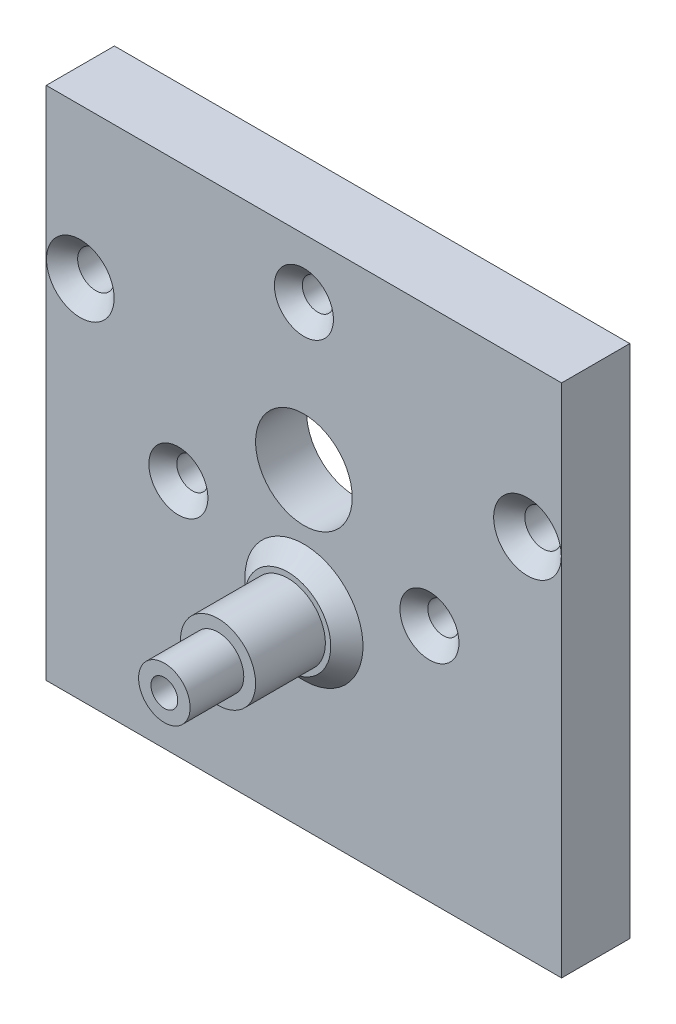
ISO-10303-21;
HEADER;
FILE_DESCRIPTION(('STEP AP214'),'2;1');
FILE_NAME('part.step','',(''),(''),'','','');
FILE_SCHEMA(('AUTOMOTIVE_DESIGN { 1 0 10303 214 1 1 1 1 }'));
ENDSEC;
DATA;
#1=APPLICATION_CONTEXT('core data for automotive mechanical design processes');
#2=APPLICATION_PROTOCOL_DEFINITION('international standard','automotive_design',2000,#1);
#3=PRODUCT_CONTEXT('',#1,'mechanical');
#4=PRODUCT('Part','Part','',(#3));
#5=PRODUCT_RELATED_PRODUCT_CATEGORY('part','',(#4));
#6=PRODUCT_DEFINITION_FORMATION('','',#4);
#7=PRODUCT_DEFINITION_CONTEXT('part definition',#1,'design');
#8=PRODUCT_DEFINITION('design','',#6,#7);
#9=PRODUCT_DEFINITION_SHAPE('','',#8);
#10=(LENGTH_UNIT() NAMED_UNIT(*) SI_UNIT(.MILLI.,.METRE.));
#11=(NAMED_UNIT(*) PLANE_ANGLE_UNIT() SI_UNIT($,.RADIAN.));
#12=(NAMED_UNIT(*) SI_UNIT($,.STERADIAN.) SOLID_ANGLE_UNIT());
#13=UNCERTAINTY_MEASURE_WITH_UNIT(LENGTH_MEASURE(1.E-05),#10,'distance_accuracy_value','');
#14=(GEOMETRIC_REPRESENTATION_CONTEXT(3) GLOBAL_UNCERTAINTY_ASSIGNED_CONTEXT((#13)) GLOBAL_UNIT_ASSIGNED_CONTEXT((#10,
#11,#12)) REPRESENTATION_CONTEXT('',''));
#15=CARTESIAN_POINT('',(0.,0.,0.));
#16=DIRECTION('',(0.,0.,1.));
#17=DIRECTION('',(1.,0.,0.));
#18=AXIS2_PLACEMENT_3D('',#15,#16,#17);
#19=CARTESIAN_POINT('',(24.,29.,0.));
#20=DIRECTION('',(0.,0.,1.));
#21=DIRECTION('',(1.,0.,0.));
#22=AXIS2_PLACEMENT_3D('',#19,#20,#21);
#23=CYLINDRICAL_SURFACE('',#22,4.5);
#24=CARTESIAN_POINT('',(24.,29.,6.35));
#25=DIRECTION('',(0.,0.,1.));
#26=DIRECTION('',(1.,0.,0.));
#27=AXIS2_PLACEMENT_3D('',#24,#25,#26);
#28=CIRCLE('',#27,4.5);
#29=CARTESIAN_POINT('',(28.5,29.,6.35));
#30=VERTEX_POINT('',#29);
#31=EDGE_CURVE('E120',#30,#30,#28,.T.);
#32=ORIENTED_EDGE('',*,*,#31,.T.);
#33=EDGE_LOOP('',(#32));
#34=FACE_BOUND('',#33,.T.);
#35=CARTESIAN_POINT('',(24.,29.,1.6));
#36=DIRECTION('',(0.,0.,-1.));
#37=DIRECTION('',(-1.,0.,0.));
#38=AXIS2_PLACEMENT_3D('',#35,#36,#37);
#39=CIRCLE('',#38,4.5);
#40=CARTESIAN_POINT('',(19.5,29.,1.6));
#41=VERTEX_POINT('',#40);
#42=EDGE_CURVE('E350',#41,#41,#39,.F.);
#43=ORIENTED_EDGE('',*,*,#42,.F.);
#44=EDGE_LOOP('',(#43));
#45=FACE_BOUND('',#44,.T.);
#46=ADVANCED_FACE('F42',(#34,#45),#23,.F.);
#47=CARTESIAN_POINT('',(24.,42.5,6.35));
#48=DIRECTION('',(0.,0.,1.));
#49=DIRECTION('',(1.,0.,0.));
#50=AXIS2_PLACEMENT_3D('',#47,#48,#49);
#51=CYLINDRICAL_SURFACE('',#50,1.45);
#52=CARTESIAN_POINT('',(24.,42.5,5.05));
#53=DIRECTION('',(0.,0.,1.));
#54=DIRECTION('',(1.,0.,0.));
#55=AXIS2_PLACEMENT_3D('',#52,#53,#54);
#56=CIRCLE('',#55,1.45);
#57=CARTESIAN_POINT('',(25.45,42.5,5.05));
#58=VERTEX_POINT('',#57);
#59=EDGE_CURVE('E330',#58,#58,#56,.T.);
#60=ORIENTED_EDGE('',*,*,#59,.T.);
#61=EDGE_LOOP('',(#60));
#62=FACE_BOUND('',#61,.T.);
#63=CARTESIAN_POINT('',(24.,42.5,1.6));
#64=DIRECTION('',(0.,0.,-1.));
#65=DIRECTION('',(-1.,0.,0.));
#66=AXIS2_PLACEMENT_3D('',#63,#64,#65);
#67=CIRCLE('',#66,1.45);
#68=CARTESIAN_POINT('',(22.55,42.5,1.6));
#69=VERTEX_POINT('',#68);
#70=EDGE_CURVE('E348',#69,#69,#67,.F.);
#71=ORIENTED_EDGE('',*,*,#70,.F.);
#72=EDGE_LOOP('',(#71));
#73=FACE_BOUND('',#72,.T.);
#74=ADVANCED_FACE('F202',(#62,#73),#51,.F.);
#75=CARTESIAN_POINT('',(35.6913429510899,22.2499999999999,6.35));
#76=DIRECTION('',(0.,0.,1.));
#77=DIRECTION('',(1.,0.,0.));
#78=AXIS2_PLACEMENT_3D('',#75,#76,#77);
#79=CYLINDRICAL_SURFACE('',#78,1.45);
#80=CARTESIAN_POINT('',(35.6913429510899,22.2499999999999,5.05));
#81=DIRECTION('',(0.,0.,1.));
#82=DIRECTION('',(1.,0.,0.));
#83=AXIS2_PLACEMENT_3D('',#80,#81,#82);
#84=CIRCLE('',#83,1.45);
#85=CARTESIAN_POINT('',(37.1413429510899,22.2499999999999,5.05));
#86=VERTEX_POINT('',#85);
#87=EDGE_CURVE('E315',#86,#86,#84,.T.);
#88=ORIENTED_EDGE('',*,*,#87,.T.);
#89=EDGE_LOOP('',(#88));
#90=FACE_BOUND('',#89,.T.);
#91=CARTESIAN_POINT('',(35.6913429510899,22.2499999999999,1.6));
#92=DIRECTION('',(0.,0.,-1.));
#93=DIRECTION('',(-1.,0.,0.));
#94=AXIS2_PLACEMENT_3D('',#91,#92,#93);
#95=CIRCLE('',#94,1.45);
#96=CARTESIAN_POINT('',(34.2413429510899,22.2499999999999,1.6));
#97=VERTEX_POINT('',#96);
#98=EDGE_CURVE('E351',#97,#97,#95,.F.);
#99=ORIENTED_EDGE('',*,*,#98,.F.);
#100=EDGE_LOOP('',(#99));
#101=FACE_BOUND('',#100,.T.);
#102=ADVANCED_FACE('F208',(#90,#101),#79,.F.);
#103=CARTESIAN_POINT('',(12.3086570489101,22.2499999999999,6.35));
#104=DIRECTION('',(0.,0.,1.));
#105=DIRECTION('',(1.,0.,0.));
#106=AXIS2_PLACEMENT_3D('',#103,#104,#105);
#107=CYLINDRICAL_SURFACE('',#106,1.45);
#108=CARTESIAN_POINT('',(12.3086570489101,22.2499999999999,5.05));
#109=DIRECTION('',(0.,0.,1.));
#110=DIRECTION('',(1.,0.,0.));
#111=AXIS2_PLACEMENT_3D('',#108,#109,#110);
#112=CIRCLE('',#111,1.45);
#113=CARTESIAN_POINT('',(13.7586570489101,22.2499999999999,5.05));
#114=VERTEX_POINT('',#113);
#115=EDGE_CURVE('E320',#114,#114,#112,.T.);
#116=ORIENTED_EDGE('',*,*,#115,.T.);
#117=EDGE_LOOP('',(#116));
#118=FACE_BOUND('',#117,.T.);
#119=CARTESIAN_POINT('',(12.3086570489101,22.2499999999999,1.6));
#120=DIRECTION('',(0.,0.,-1.));
#121=DIRECTION('',(-1.,0.,0.));
#122=AXIS2_PLACEMENT_3D('',#119,#120,#121);
#123=CIRCLE('',#122,1.45);
#124=CARTESIAN_POINT('',(10.8586570489101,22.2499999999999,1.6));
#125=VERTEX_POINT('',#124);
#126=EDGE_CURVE('E47',#125,#125,#123,.F.);
#127=ORIENTED_EDGE('',*,*,#126,.F.);
#128=EDGE_LOOP('',(#127));
#129=FACE_BOUND('',#128,.T.);
#130=ADVANCED_FACE('F282',(#118,#129),#107,.F.);
#131=CARTESIAN_POINT('',(0.,0.,6.35));
#132=DIRECTION('',(1.,0.,0.));
#133=DIRECTION('',(0.,0.,-1.));
#134=AXIS2_PLACEMENT_3D('',#131,#132,#133);
#135=PLANE('',#134);
#136=DIRECTION('',(0.,-1.,0.));
#137=VECTOR('',#136,1.);
#138=CARTESIAN_POINT('',(0.,0.,0.));
#139=LINE('',#138,#137);
#140=CARTESIAN_POINT('',(0.,48.,0.));
#141=VERTEX_POINT('',#140);
#142=CARTESIAN_POINT('',(0.,0.,0.));
#143=VERTEX_POINT('',#142);
#144=EDGE_CURVE('E156',#141,#143,#139,.T.);
#145=ORIENTED_EDGE('',*,*,#144,.T.);
#146=DIRECTION('',(0.,0.,-1.));
#147=VECTOR('',#146,1.);
#148=CARTESIAN_POINT('',(0.,0.,6.35));
#149=LINE('',#148,#147);
#150=CARTESIAN_POINT('',(0.,0.,6.35));
#151=VERTEX_POINT('',#150);
#152=EDGE_CURVE('E177',#151,#143,#149,.T.);
#153=ORIENTED_EDGE('',*,*,#152,.F.);
#154=DIRECTION('',(0.,-1.,0.));
#155=VECTOR('',#154,1.);
#156=CARTESIAN_POINT('',(0.,0.,6.35));
#157=LINE('',#156,#155);
#158=CARTESIAN_POINT('',(0.,48.,6.35));
#159=VERTEX_POINT('',#158);
#160=EDGE_CURVE('E159',#159,#151,#157,.T.);
#161=ORIENTED_EDGE('',*,*,#160,.F.);
#162=DIRECTION('',(0.,0.,-1.));
#163=VECTOR('',#162,1.);
#164=CARTESIAN_POINT('',(0.,48.,6.35));
#165=LINE('',#164,#163);
#166=EDGE_CURVE('E165',#159,#141,#165,.T.);
#167=ORIENTED_EDGE('',*,*,#166,.T.);
#168=EDGE_LOOP('',(#145,#153,#161,#167));
#169=FACE_BOUND('',#168,.T.);
#170=ADVANCED_FACE('F279',(#169),#135,.F.);
#171=CARTESIAN_POINT('',(0.,0.,6.35));
#172=DIRECTION('',(0.,1.,0.));
#173=DIRECTION('',(0.,0.,1.));
#174=AXIS2_PLACEMENT_3D('',#171,#172,#173);
#175=PLANE('',#174);
#176=CARTESIAN_POINT('',(3.175,0.,3.175));
#177=DIRECTION('',(0.,-1.,0.));
#178=DIRECTION('',(0.,0.,-1.));
#179=AXIS2_PLACEMENT_3D('',#176,#177,#178);
#180=CIRCLE('',#179,1.25);
#181=CARTESIAN_POINT('',(3.175,0.,1.925));
#182=VERTEX_POINT('',#181);
#183=EDGE_CURVE('E114',#182,#182,#180,.T.);
#184=ORIENTED_EDGE('',*,*,#183,.F.);
#185=EDGE_LOOP('',(#184));
#186=FACE_BOUND('',#185,.T.);
#187=CARTESIAN_POINT('',(44.825,0.,3.175));
#188=DIRECTION('',(0.,-1.,0.));
#189=DIRECTION('',(0.,0.,-1.));
#190=AXIS2_PLACEMENT_3D('',#187,#188,#189);
#191=CIRCLE('',#190,1.25);
#192=CARTESIAN_POINT('',(44.825,0.,1.925));
#193=VERTEX_POINT('',#192);
#194=EDGE_CURVE('E113',#193,#193,#191,.T.);
#195=ORIENTED_EDGE('',*,*,#194,.F.);
#196=EDGE_LOOP('',(#195));
#197=FACE_BOUND('',#196,.T.);
#198=DIRECTION('',(1.,0.,0.));
#199=VECTOR('',#198,1.);
#200=CARTESIAN_POINT('',(0.,0.,0.));
#201=LINE('',#200,#199);
#202=CARTESIAN_POINT('',(48.,0.,0.));
#203=VERTEX_POINT('',#202);
#204=EDGE_CURVE('E168',#143,#203,#201,.T.);
#205=ORIENTED_EDGE('',*,*,#204,.T.);
#206=DIRECTION('',(0.,0.,-1.));
#207=VECTOR('',#206,1.);
#208=CARTESIAN_POINT('',(48.,0.,6.35));
#209=LINE('',#208,#207);
#210=CARTESIAN_POINT('',(48.,0.,6.35));
#211=VERTEX_POINT('',#210);
#212=EDGE_CURVE('E175',#211,#203,#209,.T.);
#213=ORIENTED_EDGE('',*,*,#212,.F.);
#214=DIRECTION('',(1.,0.,0.));
#215=VECTOR('',#214,1.);
#216=CARTESIAN_POINT('',(0.,0.,6.35));
#217=LINE('',#216,#215);
#218=EDGE_CURVE('E93',#151,#211,#217,.T.);
#219=ORIENTED_EDGE('',*,*,#218,.F.);
#220=ORIENTED_EDGE('',*,*,#152,.T.);
#221=EDGE_LOOP('',(#205,#213,#219,#220));
#222=FACE_BOUND('',#221,.T.);
#223=ADVANCED_FACE('F277',(#186,#197,#222),#175,.F.);
#224=CARTESIAN_POINT('',(48.,0.,6.35));
#225=DIRECTION('',(-1.,0.,0.));
#226=DIRECTION('',(0.,0.,1.));
#227=AXIS2_PLACEMENT_3D('',#224,#225,#226);
#228=PLANE('',#227);
#229=DIRECTION('',(0.,1.,0.));
#230=VECTOR('',#229,1.);
#231=CARTESIAN_POINT('',(48.,0.,0.));
#232=LINE('',#231,#230);
#233=CARTESIAN_POINT('',(48.,48.,0.));
#234=VERTEX_POINT('',#233);
#235=EDGE_CURVE('E79',#203,#234,#232,.T.);
#236=ORIENTED_EDGE('',*,*,#235,.T.);
#237=DIRECTION('',(0.,0.,-1.));
#238=VECTOR('',#237,1.);
#239=CARTESIAN_POINT('',(48.,48.,6.35));
#240=LINE('',#239,#238);
#241=CARTESIAN_POINT('',(48.,48.,6.35));
#242=VERTEX_POINT('',#241);
#243=EDGE_CURVE('E173',#242,#234,#240,.T.);
#244=ORIENTED_EDGE('',*,*,#243,.F.);
#245=DIRECTION('',(0.,1.,0.));
#246=VECTOR('',#245,1.);
#247=CARTESIAN_POINT('',(48.,0.,6.35));
#248=LINE('',#247,#246);
#249=EDGE_CURVE('E162',#211,#242,#248,.T.);
#250=ORIENTED_EDGE('',*,*,#249,.F.);
#251=ORIENTED_EDGE('',*,*,#212,.T.);
#252=EDGE_LOOP('',(#236,#244,#250,#251));
#253=FACE_BOUND('',#252,.T.);
#254=ADVANCED_FACE('F274',(#253),#228,.F.);
#255=CARTESIAN_POINT('',(0.,48.,6.35));
#256=DIRECTION('',(0.,-1.,0.));
#257=DIRECTION('',(0.,0.,-1.));
#258=AXIS2_PLACEMENT_3D('',#255,#256,#257);
#259=PLANE('',#258);
#260=DIRECTION('',(-1.,0.,0.));
#261=VECTOR('',#260,1.);
#262=CARTESIAN_POINT('',(0.,48.,0.));
#263=LINE('',#262,#261);
#264=EDGE_CURVE('E85',#234,#141,#263,.T.);
#265=ORIENTED_EDGE('',*,*,#264,.T.);
#266=ORIENTED_EDGE('',*,*,#166,.F.);
#267=DIRECTION('',(-1.,0.,0.));
#268=VECTOR('',#267,1.);
#269=CARTESIAN_POINT('',(0.,48.,6.35));
#270=LINE('',#269,#268);
#271=EDGE_CURVE('E61',#242,#159,#270,.T.);
#272=ORIENTED_EDGE('',*,*,#271,.F.);
#273=ORIENTED_EDGE('',*,*,#243,.T.);
#274=EDGE_LOOP('',(#265,#266,#272,#273));
#275=FACE_BOUND('',#274,.T.);
#276=ADVANCED_FACE('F267',(#275),#259,.F.);
#277=CARTESIAN_POINT('',(0.,0.,6.35));
#278=DIRECTION('',(0.,0.,-1.));
#279=DIRECTION('',(-1.,0.,0.));
#280=AXIS2_PLACEMENT_3D('',#277,#278,#279);
#281=PLANE('',#280);
#282=CARTESIAN_POINT('',(12.3086570489101,22.2499999999999,6.35));
#283=DIRECTION('',(0.,0.,1.));
#284=DIRECTION('',(1.,0.,0.));
#285=AXIS2_PLACEMENT_3D('',#282,#283,#284);
#286=CIRCLE('',#285,2.75);
#287=CARTESIAN_POINT('',(15.0586570489101,22.2499999999999,6.35));
#288=VERTEX_POINT('',#287);
#289=EDGE_CURVE('E324',#288,#288,#286,.T.);
#290=ORIENTED_EDGE('',*,*,#289,.F.);
#291=EDGE_LOOP('',(#290));
#292=FACE_BOUND('',#291,.T.);
#293=CARTESIAN_POINT('',(35.6913429510899,22.2499999999999,6.35));
#294=DIRECTION('',(0.,0.,1.));
#295=DIRECTION('',(1.,0.,0.));
#296=AXIS2_PLACEMENT_3D('',#293,#294,#295);
#297=CIRCLE('',#296,2.75);
#298=CARTESIAN_POINT('',(38.4413429510899,22.2499999999999,6.35));
#299=VERTEX_POINT('',#298);
#300=EDGE_CURVE('E318',#299,#299,#297,.T.);
#301=ORIENTED_EDGE('',*,*,#300,.F.);
#302=EDGE_LOOP('',(#301));
#303=FACE_BOUND('',#302,.T.);
#304=CARTESIAN_POINT('',(24.,42.5,6.35));
#305=DIRECTION('',(0.,0.,1.));
#306=DIRECTION('',(1.,0.,0.));
#307=AXIS2_PLACEMENT_3D('',#304,#305,#306);
#308=CIRCLE('',#307,2.75);
#309=CARTESIAN_POINT('',(26.75,42.5,6.35));
#310=VERTEX_POINT('',#309);
#311=EDGE_CURVE('E322',#310,#310,#308,.T.);
#312=ORIENTED_EDGE('',*,*,#311,.F.);
#313=EDGE_LOOP('',(#312));
#314=FACE_BOUND('',#313,.T.);
#315=ORIENTED_EDGE('',*,*,#31,.F.);
#316=EDGE_LOOP('',(#315));
#317=FACE_BOUND('',#316,.T.);
#318=CARTESIAN_POINT('',(24.,17.5,6.35));
#319=DIRECTION('',(0.,0.,-1.));
#320=DIRECTION('',(-1.,0.,0.));
#321=AXIS2_PLACEMENT_3D('',#318,#319,#320);
#322=CIRCLE('',#321,5.49999999999998);
#323=CARTESIAN_POINT('',(18.5,17.5,6.35));
#324=VERTEX_POINT('',#323);
#325=EDGE_CURVE('E11',#324,#324,#322,.T.);
#326=ORIENTED_EDGE('',*,*,#325,.T.);
#327=EDGE_LOOP('',(#326));
#328=FACE_BOUND('',#327,.T.);
#329=CARTESIAN_POINT('',(44.825,34.,6.35));
#330=DIRECTION('',(0.,0.,1.));
#331=DIRECTION('',(1.,0.,0.));
#332=AXIS2_PLACEMENT_3D('',#329,#330,#331);
#333=CIRCLE('',#332,3.15);
#334=CARTESIAN_POINT('',(47.975,34.,6.35));
#335=VERTEX_POINT('',#334);
#336=EDGE_CURVE('E126',#335,#335,#333,.T.);
#337=ORIENTED_EDGE('',*,*,#336,.F.);
#338=EDGE_LOOP('',(#337));
#339=FACE_BOUND('',#338,.T.);
#340=CARTESIAN_POINT('',(3.175,34.,6.35));
#341=DIRECTION('',(0.,0.,1.));
#342=DIRECTION('',(1.,0.,0.));
#343=AXIS2_PLACEMENT_3D('',#340,#341,#342);
#344=CIRCLE('',#343,3.15);
#345=CARTESIAN_POINT('',(6.325,34.,6.35));
#346=VERTEX_POINT('',#345);
#347=EDGE_CURVE('E133',#346,#346,#344,.T.);
#348=ORIENTED_EDGE('',*,*,#347,.F.);
#349=EDGE_LOOP('',(#348));
#350=FACE_BOUND('',#349,.T.);
#351=ORIENTED_EDGE('',*,*,#160,.T.);
#352=ORIENTED_EDGE('',*,*,#218,.T.);
#353=ORIENTED_EDGE('',*,*,#249,.T.);
#354=ORIENTED_EDGE('',*,*,#271,.T.);
#355=EDGE_LOOP('',(#351,#352,#353,#354));
#356=FACE_BOUND('',#355,.T.);
#357=ADVANCED_FACE('F264',(#292,#303,#314,#317,#328,#339,#350,#356),#281,.F.);
#358=CARTESIAN_POINT('',(0.,0.,0.));
#359=DIRECTION('',(0.,0.,-1.));
#360=DIRECTION('',(-1.,0.,0.));
#361=AXIS2_PLACEMENT_3D('',#358,#359,#360);
#362=PLANE('',#361);
#363=CARTESIAN_POINT('',(24.,29.,0.));
#364=DIRECTION('',(0.,0.,-1.));
#365=DIRECTION('',(-1.,0.,0.));
#366=AXIS2_PLACEMENT_3D('',#363,#364,#365);
#367=CIRCLE('',#366,17.5);
#368=CARTESIAN_POINT('',(6.5,29.,0.));
#369=VERTEX_POINT('',#368);
#370=EDGE_CURVE('E361',#369,#369,#367,.T.);
#371=ORIENTED_EDGE('',*,*,#370,.F.);
#372=EDGE_LOOP('',(#371));
#373=FACE_BOUND('',#372,.T.);
#374=CARTESIAN_POINT('',(44.825,34.,0.));
#375=DIRECTION('',(0.,0.,-1.));
#376=DIRECTION('',(-1.,0.,0.));
#377=AXIS2_PLACEMENT_3D('',#374,#375,#376);
#378=CIRCLE('',#377,1.7);
#379=CARTESIAN_POINT('',(43.125,34.,0.));
#380=VERTEX_POINT('',#379);
#381=EDGE_CURVE('E132',#380,#380,#378,.T.);
#382=ORIENTED_EDGE('',*,*,#381,.F.);
#383=EDGE_LOOP('',(#382));
#384=FACE_BOUND('',#383,.T.);
#385=CARTESIAN_POINT('',(3.175,34.,0.));
#386=DIRECTION('',(0.,0.,-1.));
#387=DIRECTION('',(-1.,0.,0.));
#388=AXIS2_PLACEMENT_3D('',#385,#386,#387);
#389=CIRCLE('',#388,1.7);
#390=CARTESIAN_POINT('',(1.475,34.,0.));
#391=VERTEX_POINT('',#390);
#392=EDGE_CURVE('E139',#391,#391,#389,.T.);
#393=ORIENTED_EDGE('',*,*,#392,.F.);
#394=EDGE_LOOP('',(#393));
#395=FACE_BOUND('',#394,.T.);
#396=ORIENTED_EDGE('',*,*,#144,.F.);
#397=ORIENTED_EDGE('',*,*,#264,.F.);
#398=ORIENTED_EDGE('',*,*,#235,.F.);
#399=ORIENTED_EDGE('',*,*,#204,.F.);
#400=EDGE_LOOP('',(#396,#397,#398,#399));
#401=FACE_BOUND('',#400,.T.);
#402=ADVANCED_FACE('F253',(#373,#384,#395,#401),#362,.T.);
#403=CARTESIAN_POINT('',(24.,17.5,7.85));
#404=DIRECTION('',(0.,0.,1.));
#405=DIRECTION('',(1.,0.,0.));
#406=AXIS2_PLACEMENT_3D('',#403,#404,#405);
#407=PLANE('',#406);
#408=CARTESIAN_POINT('',(24.,17.5,7.85));
#409=DIRECTION('',(0.,0.,1.));
#410=DIRECTION('',(1.,0.,0.));
#411=AXIS2_PLACEMENT_3D('',#408,#409,#410);
#412=CIRCLE('',#411,3.99999999999997);
#413=CARTESIAN_POINT('',(28.,17.5,7.85));
#414=VERTEX_POINT('',#413);
#415=EDGE_CURVE('E53',#414,#414,#412,.T.);
#416=ORIENTED_EDGE('',*,*,#415,.T.);
#417=EDGE_LOOP('',(#416));
#418=FACE_BOUND('',#417,.T.);
#419=CARTESIAN_POINT('',(24.,17.5,7.85));
#420=DIRECTION('',(0.,0.,1.));
#421=DIRECTION('',(1.,0.,0.));
#422=AXIS2_PLACEMENT_3D('',#419,#420,#421);
#423=CIRCLE('',#422,3.5);
#424=CARTESIAN_POINT('',(27.5,17.5,7.85));
#425=VERTEX_POINT('',#424);
#426=EDGE_CURVE('E147',#425,#425,#423,.T.);
#427=ORIENTED_EDGE('',*,*,#426,.F.);
#428=EDGE_LOOP('',(#427));
#429=FACE_BOUND('',#428,.T.);
#430=ADVANCED_FACE('F186',(#418,#429),#407,.T.);
#431=CARTESIAN_POINT('',(24.,17.5,7.85));
#432=DIRECTION('',(0.,0.,1.));
#433=DIRECTION('',(1.,0.,0.));
#434=AXIS2_PLACEMENT_3D('',#431,#432,#433);
#435=CYLINDRICAL_SURFACE('',#434,3.5);
#436=CARTESIAN_POINT('',(24.,17.5,14.35));
#437=DIRECTION('',(0.,0.,1.));
#438=DIRECTION('',(1.,0.,0.));
#439=AXIS2_PLACEMENT_3D('',#436,#437,#438);
#440=CIRCLE('',#439,3.5);
#441=CARTESIAN_POINT('',(27.5,17.5,14.35));
#442=VERTEX_POINT('',#441);
#443=EDGE_CURVE('E146',#442,#442,#440,.T.);
#444=CARTESIAN_POINT('',(27.5,17.5,7.85));
#445=CARTESIAN_POINT('',(27.5,17.5,7.91770833333333));
#446=CARTESIAN_POINT('',(27.5,17.5,7.98541666666666));
#447=CARTESIAN_POINT('',(27.5,17.5,8.12083333333333));
#448=CARTESIAN_POINT('',(27.5,17.5,8.18854166666667));
#449=CARTESIAN_POINT('',(27.5,17.5,8.32395833333333));
#450=CARTESIAN_POINT('',(27.5,17.5,8.39166666666667));
#451=CARTESIAN_POINT('',(27.5,17.5,8.52708333333333));
#452=CARTESIAN_POINT('',(27.5,17.5,8.59479166666667));
#453=CARTESIAN_POINT('',(27.5,17.5,8.73020833333333));
#454=CARTESIAN_POINT('',(27.5,17.5,8.79791666666667));
#455=CARTESIAN_POINT('',(27.5,17.5,8.93333333333333));
#456=CARTESIAN_POINT('',(27.5,17.5,9.00104166666667));
#457=CARTESIAN_POINT('',(27.5,17.5,9.13645833333333));
#458=CARTESIAN_POINT('',(27.5,17.5,9.20416666666667));
#459=CARTESIAN_POINT('',(27.5,17.5,9.33958333333333));
#460=CARTESIAN_POINT('',(27.5,17.5,9.40729166666666));
#461=CARTESIAN_POINT('',(27.5,17.5,9.54270833333333));
#462=CARTESIAN_POINT('',(27.5,17.5,9.61041666666666));
#463=CARTESIAN_POINT('',(27.5,17.5,9.74583333333333));
#464=CARTESIAN_POINT('',(27.5,17.5,9.81354166666667));
#465=CARTESIAN_POINT('',(27.5,17.5,9.94895833333333));
#466=CARTESIAN_POINT('',(27.5,17.5,10.0166666666667));
#467=CARTESIAN_POINT('',(27.5,17.5,10.1520833333333));
#468=CARTESIAN_POINT('',(27.5,17.5,10.2197916666667));
#469=CARTESIAN_POINT('',(27.5,17.5,10.3552083333333));
#470=CARTESIAN_POINT('',(27.5,17.5,10.4229166666667));
#471=CARTESIAN_POINT('',(27.5,17.5,10.5583333333333));
#472=CARTESIAN_POINT('',(27.5,17.5,10.6260416666667));
#473=CARTESIAN_POINT('',(27.5,17.5,10.7614583333333));
#474=CARTESIAN_POINT('',(27.5,17.5,10.8291666666667));
#475=CARTESIAN_POINT('',(27.5,17.5,10.9645833333333));
#476=CARTESIAN_POINT('',(27.5,17.5,11.0322916666667));
#477=CARTESIAN_POINT('',(27.5,17.5,11.1677083333333));
#478=CARTESIAN_POINT('',(27.5,17.5,11.2354166666667));
#479=CARTESIAN_POINT('',(27.5,17.5,11.3708333333333));
#480=CARTESIAN_POINT('',(27.5,17.5,11.4385416666667));
#481=CARTESIAN_POINT('',(27.5,17.5,11.5739583333333));
#482=CARTESIAN_POINT('',(27.5,17.5,11.6416666666667));
#483=CARTESIAN_POINT('',(27.5,17.5,11.7770833333333));
#484=CARTESIAN_POINT('',(27.5,17.5,11.8447916666667));
#485=CARTESIAN_POINT('',(27.5,17.5,11.9802083333333));
#486=CARTESIAN_POINT('',(27.5,17.5,12.0479166666667));
#487=CARTESIAN_POINT('',(27.5,17.5,12.1833333333333));
#488=CARTESIAN_POINT('',(27.5,17.5,12.2510416666667));
#489=CARTESIAN_POINT('',(27.5,17.5,12.3864583333333));
#490=CARTESIAN_POINT('',(27.5,17.5,12.4541666666667));
#491=CARTESIAN_POINT('',(27.5,17.5,12.5895833333333));
#492=CARTESIAN_POINT('',(27.5,17.5,12.6572916666667));
#493=CARTESIAN_POINT('',(27.5,17.5,12.7927083333333));
#494=CARTESIAN_POINT('',(27.5,17.5,12.8604166666667));
#495=CARTESIAN_POINT('',(27.5,17.5,12.9958333333333));
#496=CARTESIAN_POINT('',(27.5,17.5,13.0635416666667));
#497=CARTESIAN_POINT('',(27.5,17.5,13.1989583333333));
#498=CARTESIAN_POINT('',(27.5,17.5,13.2666666666667));
#499=CARTESIAN_POINT('',(27.5,17.5,13.4020833333333));
#500=CARTESIAN_POINT('',(27.5,17.5,13.4697916666667));
#501=CARTESIAN_POINT('',(27.5,17.5,13.6052083333333));
#502=CARTESIAN_POINT('',(27.5,17.5,13.6729166666667));
#503=CARTESIAN_POINT('',(27.5,17.5,13.8083333333333));
#504=CARTESIAN_POINT('',(27.5,17.5,13.8760416666667));
#505=CARTESIAN_POINT('',(27.5,17.5,14.0114583333333));
#506=CARTESIAN_POINT('',(27.5,17.5,14.0791666666667));
#507=CARTESIAN_POINT('',(27.5,17.5,14.2145833333333));
#508=CARTESIAN_POINT('',(27.5,17.5,14.2822916666667));
#509=CARTESIAN_POINT('',(27.5,17.5,14.35));
#510=B_SPLINE_CURVE_WITH_KNOTS('',3,(#444,#445,#446,#447,#448,#449,#450,#451,#452,#453,#454,
#455,#456,#457,#458,#459,#460,#461,#462,#463,#464,#465,#466,#467,#468,#469,#470,#471,#472,#473,
#474,#475,#476,#477,#478,#479,#480,#481,#482,#483,#484,#485,#486,#487,#488,#489,#490,#491,#492,
#493,#494,#495,#496,#497,#498,#499,#500,#501,#502,#503,#504,#505,#506,#507,#508,#509),
.UNSPECIFIED.,.F.,.F.,(4,2,2,2,2,2,2,2,2,2,2,2,2,2,2,2,2,2,2,2,2,2,2,2,2,2,2,2,2,2,2,2,4),(0.,
0.203124999999998,0.406249999999999,0.609374999999999,0.812499999999999,1.015625,1.21875,
1.421875,1.625,1.828125,2.03125,2.234375,2.4375,2.640625,2.84375,3.046875,3.25,3.453125,3.65625,
3.859375,4.0625,4.265625,4.46875,4.671875,4.875,5.078125,5.28125,5.484375,5.6875,5.890625,
6.09375,6.296875,6.5),.UNSPECIFIED.);
#511=EDGE_CURVE('BSEAM246',#425,#442,#510,.T.);
#512=ORIENTED_EDGE('',*,*,#426,.T.);
#513=ORIENTED_EDGE('',*,*,#443,.F.);
#514=ORIENTED_EDGE('',*,*,#511,.T.);
#515=ORIENTED_EDGE('',*,*,#511,.F.);
#516=EDGE_LOOP('',(#512,#514,#513,#515));
#517=FACE_BOUND('',#516,.T.);
#518=ADVANCED_FACE('F246',(#517),#435,.T.);
#519=CARTESIAN_POINT('',(24.,17.5,19.35));
#520=DIRECTION('',(0.,0.,1.));
#521=DIRECTION('',(1.,0.,0.));
#522=AXIS2_PLACEMENT_3D('',#519,#520,#521);
#523=PLANE('',#522);
#524=CARTESIAN_POINT('',(24.,17.5,19.35));
#525=DIRECTION('',(0.,0.,1.));
#526=DIRECTION('',(1.,0.,0.));
#527=AXIS2_PLACEMENT_3D('',#524,#525,#526);
#528=CIRCLE('',#527,1.25);
#529=CARTESIAN_POINT('',(25.25,17.5,19.35));
#530=VERTEX_POINT('',#529);
#531=EDGE_CURVE('E140',#530,#530,#528,.T.);
#532=ORIENTED_EDGE('',*,*,#531,.F.);
#533=EDGE_LOOP('',(#532));
#534=FACE_BOUND('',#533,.T.);
#535=CARTESIAN_POINT('',(24.,17.5,19.35));
#536=DIRECTION('',(0.,0.,1.));
#537=DIRECTION('',(1.,0.,0.));
#538=AXIS2_PLACEMENT_3D('',#535,#536,#537);
#539=CIRCLE('',#538,2.4);
#540=CARTESIAN_POINT('',(26.4,17.5,19.35));
#541=VERTEX_POINT('',#540);
#542=EDGE_CURVE('E150',#541,#541,#539,.T.);
#543=ORIENTED_EDGE('',*,*,#542,.T.);
#544=EDGE_LOOP('',(#543));
#545=FACE_BOUND('',#544,.T.);
#546=ADVANCED_FACE('F249',(#534,#545),#523,.T.);
#547=CARTESIAN_POINT('',(24.,17.5,14.35));
#548=DIRECTION('',(0.,0.,1.));
#549=DIRECTION('',(1.,0.,0.));
#550=AXIS2_PLACEMENT_3D('',#547,#548,#549);
#551=CYLINDRICAL_SURFACE('',#550,2.4);
#552=CARTESIAN_POINT('',(24.,17.5,14.35));
#553=DIRECTION('',(0.,0.,1.));
#554=DIRECTION('',(1.,0.,0.));
#555=AXIS2_PLACEMENT_3D('',#552,#553,#554);
#556=CIRCLE('',#555,2.4);
#557=CARTESIAN_POINT('',(26.4,17.5,14.35));
#558=VERTEX_POINT('',#557);
#559=EDGE_CURVE('E153',#558,#558,#556,.T.);
#560=ORIENTED_EDGE('',*,*,#559,.T.);
#561=EDGE_LOOP('',(#560));
#562=FACE_BOUND('',#561,.T.);
#563=ORIENTED_EDGE('',*,*,#542,.F.);
#564=EDGE_LOOP('',(#563));
#565=FACE_BOUND('',#564,.T.);
#566=ADVANCED_FACE('F254',(#562,#565),#551,.T.);
#567=CARTESIAN_POINT('',(24.,17.5,14.35));
#568=DIRECTION('',(0.,0.,1.));
#569=DIRECTION('',(1.,0.,0.));
#570=AXIS2_PLACEMENT_3D('',#567,#568,#569);
#571=PLANE('',#570);
#572=ORIENTED_EDGE('',*,*,#559,.F.);
#573=EDGE_LOOP('',(#572));
#574=FACE_BOUND('',#573,.T.);
#575=ORIENTED_EDGE('',*,*,#443,.T.);
#576=EDGE_LOOP('',(#575));
#577=FACE_BOUND('',#576,.T.);
#578=ADVANCED_FACE('F244',(#574,#577),#571,.T.);
#579=CARTESIAN_POINT('',(24.,17.5,10.85));
#580=DIRECTION('',(0.,0.,1.));
#581=DIRECTION('',(1.,0.,0.));
#582=AXIS2_PLACEMENT_3D('',#579,#580,#581);
#583=CONICAL_SURFACE('',#582,1.25,1.02974425867665);
#584=CARTESIAN_POINT('',(24.,17.5,10.0989242262155));
#585=VERTEX_POINT('',#584);
#586=VERTEX_LOOP('',#585);
#587=FACE_BOUND('',#586,.T.);
#588=CARTESIAN_POINT('',(24.,17.5,10.85));
#589=DIRECTION('',(0.,0.,1.));
#590=DIRECTION('',(1.,0.,0.));
#591=AXIS2_PLACEMENT_3D('',#588,#589,#590);
#592=CIRCLE('',#591,1.25);
#593=CARTESIAN_POINT('',(25.25,17.5,10.85));
#594=VERTEX_POINT('',#593);
#595=EDGE_CURVE('E143',#594,#594,#592,.T.);
#596=ORIENTED_EDGE('',*,*,#595,.T.);
#597=EDGE_LOOP('',(#596));
#598=FACE_BOUND('',#597,.T.);
#599=ADVANCED_FACE('F240',(#587,#598),#583,.F.);
#600=CARTESIAN_POINT('',(24.,17.5,19.35));
#601=DIRECTION('',(0.,0.,1.));
#602=DIRECTION('',(1.,0.,0.));
#603=AXIS2_PLACEMENT_3D('',#600,#601,#602);
#604=CYLINDRICAL_SURFACE('',#603,1.25);
#605=ORIENTED_EDGE('',*,*,#595,.F.);
#606=EDGE_LOOP('',(#605));
#607=FACE_BOUND('',#606,.T.);
#608=ORIENTED_EDGE('',*,*,#531,.T.);
#609=EDGE_LOOP('',(#608));
#610=FACE_BOUND('',#609,.T.);
#611=ADVANCED_FACE('F236',(#607,#610),#604,.F.);
#612=CARTESIAN_POINT('',(3.175,34.,6.35));
#613=DIRECTION('',(0.,0.,1.));
#614=DIRECTION('',(1.,0.,0.));
#615=AXIS2_PLACEMENT_3D('',#612,#613,#614);
#616=CYLINDRICAL_SURFACE('',#615,1.7);
#617=ORIENTED_EDGE('',*,*,#392,.T.);
#618=EDGE_LOOP('',(#617));
#619=FACE_BOUND('',#618,.T.);
#620=CARTESIAN_POINT('',(3.175,34.,4.9));
#621=DIRECTION('',(0.,0.,1.));
#622=DIRECTION('',(1.,0.,0.));
#623=AXIS2_PLACEMENT_3D('',#620,#621,#622);
#624=CIRCLE('',#623,1.7);
#625=CARTESIAN_POINT('',(4.875,34.,4.9));
#626=VERTEX_POINT('',#625);
#627=EDGE_CURVE('E136',#626,#626,#624,.T.);
#628=ORIENTED_EDGE('',*,*,#627,.T.);
#629=EDGE_LOOP('',(#628));
#630=FACE_BOUND('',#629,.T.);
#631=ADVANCED_FACE('F232',(#619,#630),#616,.F.);
#632=CARTESIAN_POINT('',(3.175,34.,6.35));
#633=DIRECTION('',(0.,0.,1.));
#634=DIRECTION('',(1.,0.,0.));
#635=AXIS2_PLACEMENT_3D('',#632,#633,#634);
#636=CONICAL_SURFACE('',#635,3.15,0.785398163397449);
#637=ORIENTED_EDGE('',*,*,#627,.F.);
#638=EDGE_LOOP('',(#637));
#639=FACE_BOUND('',#638,.T.);
#640=ORIENTED_EDGE('',*,*,#347,.T.);
#641=EDGE_LOOP('',(#640));
#642=FACE_BOUND('',#641,.T.);
#643=ADVANCED_FACE('F228',(#639,#642),#636,.F.);
#644=CARTESIAN_POINT('',(44.825,34.,6.35));
#645=DIRECTION('',(0.,0.,1.));
#646=DIRECTION('',(1.,0.,0.));
#647=AXIS2_PLACEMENT_3D('',#644,#645,#646);
#648=CYLINDRICAL_SURFACE('',#647,1.7);
#649=ORIENTED_EDGE('',*,*,#381,.T.);
#650=EDGE_LOOP('',(#649));
#651=FACE_BOUND('',#650,.T.);
#652=CARTESIAN_POINT('',(44.825,34.,4.9));
#653=DIRECTION('',(0.,0.,1.));
#654=DIRECTION('',(1.,0.,0.));
#655=AXIS2_PLACEMENT_3D('',#652,#653,#654);
#656=CIRCLE('',#655,1.7);
#657=CARTESIAN_POINT('',(46.525,34.,4.9));
#658=VERTEX_POINT('',#657);
#659=EDGE_CURVE('E129',#658,#658,#656,.T.);
#660=ORIENTED_EDGE('',*,*,#659,.T.);
#661=EDGE_LOOP('',(#660));
#662=FACE_BOUND('',#661,.T.);
#663=ADVANCED_FACE('F224',(#651,#662),#648,.F.);
#664=CARTESIAN_POINT('',(44.825,34.,6.35));
#665=DIRECTION('',(0.,0.,1.));
#666=DIRECTION('',(1.,0.,0.));
#667=AXIS2_PLACEMENT_3D('',#664,#665,#666);
#668=CONICAL_SURFACE('',#667,3.15,0.785398163397448);
#669=ORIENTED_EDGE('',*,*,#659,.F.);
#670=EDGE_LOOP('',(#669));
#671=FACE_BOUND('',#670,.T.);
#672=ORIENTED_EDGE('',*,*,#336,.T.);
#673=EDGE_LOOP('',(#672));
#674=FACE_BOUND('',#673,.T.);
#675=ADVANCED_FACE('F220',(#671,#674),#668,.F.);
#676=CARTESIAN_POINT('',(44.825,9.24892422621555,3.175));
#677=DIRECTION('',(0.,-1.,0.));
#678=DIRECTION('',(0.,0.,-1.));
#679=AXIS2_PLACEMENT_3D('',#676,#677,#678);
#680=CONICAL_SURFACE('',#679,1.24999999999999,1.02974425867665);
#681=CARTESIAN_POINT('',(44.825,10.,3.175));
#682=VERTEX_POINT('',#681);
#683=VERTEX_LOOP('',#682);
#684=FACE_BOUND('',#683,.T.);
#685=CARTESIAN_POINT('',(44.825,9.24892422621555,3.175));
#686=DIRECTION('',(0.,-1.,0.));
#687=DIRECTION('',(0.,0.,-1.));
#688=AXIS2_PLACEMENT_3D('',#685,#686,#687);
#689=CIRCLE('',#688,1.24999999999999);
#690=CARTESIAN_POINT('',(44.825,9.24892422621555,1.92500000000001));
#691=VERTEX_POINT('',#690);
#692=EDGE_CURVE('E117',#691,#691,#689,.T.);
#693=ORIENTED_EDGE('',*,*,#692,.T.);
#694=EDGE_LOOP('',(#693));
#695=FACE_BOUND('',#694,.T.);
#696=ADVANCED_FACE('F216',(#684,#695),#680,.F.);
#697=CARTESIAN_POINT('',(44.825,0.,3.175));
#698=DIRECTION('',(0.,-1.,0.));
#699=DIRECTION('',(0.,0.,-1.));
#700=AXIS2_PLACEMENT_3D('',#697,#698,#699);
#701=CYLINDRICAL_SURFACE('',#700,1.25);
#702=ORIENTED_EDGE('',*,*,#692,.F.);
#703=EDGE_LOOP('',(#702));
#704=FACE_BOUND('',#703,.T.);
#705=ORIENTED_EDGE('',*,*,#194,.T.);
#706=EDGE_LOOP('',(#705));
#707=FACE_BOUND('',#706,.T.);
#708=ADVANCED_FACE('F107',(#704,#707),#701,.F.);
#709=CARTESIAN_POINT('',(3.175,9.24892422621555,3.175));
#710=DIRECTION('',(0.,-1.,0.));
#711=DIRECTION('',(0.,0.,-1.));
#712=AXIS2_PLACEMENT_3D('',#709,#710,#711);
#713=CONICAL_SURFACE('',#712,1.25,1.02974425867665);
#714=CARTESIAN_POINT('',(3.175,10.,3.175));
#715=VERTEX_POINT('',#714);
#716=VERTEX_LOOP('',#715);
#717=FACE_BOUND('',#716,.T.);
#718=CARTESIAN_POINT('',(3.175,9.24892422621555,3.175));
#719=DIRECTION('',(0.,-1.,0.));
#720=DIRECTION('',(0.,0.,-1.));
#721=AXIS2_PLACEMENT_3D('',#718,#719,#720);
#722=CIRCLE('',#721,1.25);
#723=CARTESIAN_POINT('',(3.175,9.24892422621555,1.925));
#724=VERTEX_POINT('',#723);
#725=EDGE_CURVE('E111',#724,#724,#722,.T.);
#726=ORIENTED_EDGE('',*,*,#725,.T.);
#727=EDGE_LOOP('',(#726));
#728=FACE_BOUND('',#727,.T.);
#729=ADVANCED_FACE('F103',(#717,#728),#713,.F.);
#730=CARTESIAN_POINT('',(3.175,0.,3.175));
#731=DIRECTION('',(0.,-1.,0.));
#732=DIRECTION('',(0.,0.,-1.));
#733=AXIS2_PLACEMENT_3D('',#730,#731,#732);
#734=CYLINDRICAL_SURFACE('',#733,1.25);
#735=ORIENTED_EDGE('',*,*,#725,.F.);
#736=EDGE_LOOP('',(#735));
#737=FACE_BOUND('',#736,.T.);
#738=ORIENTED_EDGE('',*,*,#183,.T.);
#739=EDGE_LOOP('',(#738));
#740=FACE_BOUND('',#739,.T.);
#741=ADVANCED_FACE('F106',(#737,#740),#734,.F.);
#742=CARTESIAN_POINT('',(24.,17.5,7.85));
#743=DIRECTION('',(0.,0.,-1.));
#744=DIRECTION('',(-1.,0.,0.));
#745=AXIS2_PLACEMENT_3D('',#742,#743,#744);
#746=CONICAL_SURFACE('',#745,3.99999999999997,0.785398163397453);
#747=ORIENTED_EDGE('',*,*,#325,.F.);
#748=EDGE_LOOP('',(#747));
#749=FACE_BOUND('',#748,.T.);
#750=ORIENTED_EDGE('',*,*,#415,.F.);
#751=EDGE_LOOP('',(#750));
#752=FACE_BOUND('',#751,.T.);
#753=ADVANCED_FACE('F45',(#749,#752),#746,.T.);
#754=CARTESIAN_POINT('',(24.,42.5,6.35));
#755=DIRECTION('',(0.,0.,1.));
#756=DIRECTION('',(1.,0.,0.));
#757=AXIS2_PLACEMENT_3D('',#754,#755,#756);
#758=CONICAL_SURFACE('',#757,2.75,0.785398163397448);
#759=ORIENTED_EDGE('',*,*,#59,.F.);
#760=EDGE_LOOP('',(#759));
#761=FACE_BOUND('',#760,.T.);
#762=ORIENTED_EDGE('',*,*,#311,.T.);
#763=EDGE_LOOP('',(#762));
#764=FACE_BOUND('',#763,.T.);
#765=ADVANCED_FACE('F190',(#761,#764),#758,.F.);
#766=CARTESIAN_POINT('',(35.6913429510899,22.2499999999999,6.35));
#767=DIRECTION('',(0.,0.,1.));
#768=DIRECTION('',(1.,0.,0.));
#769=AXIS2_PLACEMENT_3D('',#766,#767,#768);
#770=CONICAL_SURFACE('',#769,2.75,0.78539816339745);
#771=ORIENTED_EDGE('',*,*,#87,.F.);
#772=EDGE_LOOP('',(#771));
#773=FACE_BOUND('',#772,.T.);
#774=ORIENTED_EDGE('',*,*,#300,.T.);
#775=EDGE_LOOP('',(#774));
#776=FACE_BOUND('',#775,.T.);
#777=ADVANCED_FACE('F196',(#773,#776),#770,.F.);
#778=CARTESIAN_POINT('',(12.3086570489101,22.2499999999999,6.35));
#779=DIRECTION('',(0.,0.,1.));
#780=DIRECTION('',(1.,0.,0.));
#781=AXIS2_PLACEMENT_3D('',#778,#779,#780);
#782=CONICAL_SURFACE('',#781,2.75,0.785398163397448);
#783=ORIENTED_EDGE('',*,*,#115,.F.);
#784=EDGE_LOOP('',(#783));
#785=FACE_BOUND('',#784,.T.);
#786=ORIENTED_EDGE('',*,*,#289,.T.);
#787=EDGE_LOOP('',(#786));
#788=FACE_BOUND('',#787,.T.);
#789=ADVANCED_FACE('F303',(#785,#788),#782,.F.);
#790=CARTESIAN_POINT('',(24.,29.,1.6));
#791=DIRECTION('',(0.,0.,-1.));
#792=DIRECTION('',(-1.,0.,0.));
#793=AXIS2_PLACEMENT_3D('',#790,#791,#792);
#794=PLANE('',#793);
#795=CARTESIAN_POINT('',(24.,29.,1.6));
#796=DIRECTION('',(0.,0.,-1.));
#797=DIRECTION('',(-1.,0.,0.));
#798=AXIS2_PLACEMENT_3D('',#795,#796,#797);
#799=CIRCLE('',#798,17.5);
#800=CARTESIAN_POINT('',(6.5,29.,1.6));
#801=VERTEX_POINT('',#800);
#802=EDGE_CURVE('E364',#801,#801,#799,.T.);
#803=ORIENTED_EDGE('',*,*,#802,.T.);
#804=EDGE_LOOP('',(#803));
#805=FACE_BOUND('',#804,.T.);
#806=ORIENTED_EDGE('',*,*,#126,.T.);
#807=EDGE_LOOP('',(#806));
#808=FACE_BOUND('',#807,.T.);
#809=ORIENTED_EDGE('',*,*,#98,.T.);
#810=EDGE_LOOP('',(#809));
#811=FACE_BOUND('',#810,.T.);
#812=ORIENTED_EDGE('',*,*,#70,.T.);
#813=EDGE_LOOP('',(#812));
#814=FACE_BOUND('',#813,.T.);
#815=ORIENTED_EDGE('',*,*,#42,.T.);
#816=EDGE_LOOP('',(#815));
#817=FACE_BOUND('',#816,.T.);
#818=ADVANCED_FACE('F310',(#805,#808,#811,#814,#817),#794,.T.);
#819=CARTESIAN_POINT('',(24.,29.,1.6));
#820=DIRECTION('',(0.,0.,-1.));
#821=DIRECTION('',(-1.,0.,0.));
#822=AXIS2_PLACEMENT_3D('',#819,#820,#821);
#823=CYLINDRICAL_SURFACE('',#822,17.5);
#824=ORIENTED_EDGE('',*,*,#802,.F.);
#825=EDGE_LOOP('',(#824));
#826=FACE_BOUND('',#825,.T.);
#827=ORIENTED_EDGE('',*,*,#370,.T.);
#828=EDGE_LOOP('',(#827));
#829=FACE_BOUND('',#828,.T.);
#830=ADVANCED_FACE('F373',(#826,#829),#823,.F.);
#831=CLOSED_SHELL('',(#46,#74,#102,#130,#170,#223,#254,#276,#357,#402,#430,#518,#546,#566,#578,
#599,#611,#631,#643,#663,#675,#696,#708,#729,#741,#753,#765,#777,#789,#818,#830));
#832=MANIFOLD_SOLID_BREP('B2',#831);
#833=ADVANCED_BREP_SHAPE_REPRESENTATION('',(#18,#832),#14);
#834=SHAPE_DEFINITION_REPRESENTATION(#9,#833);
ENDSEC;
END-ISO-10303-21;
